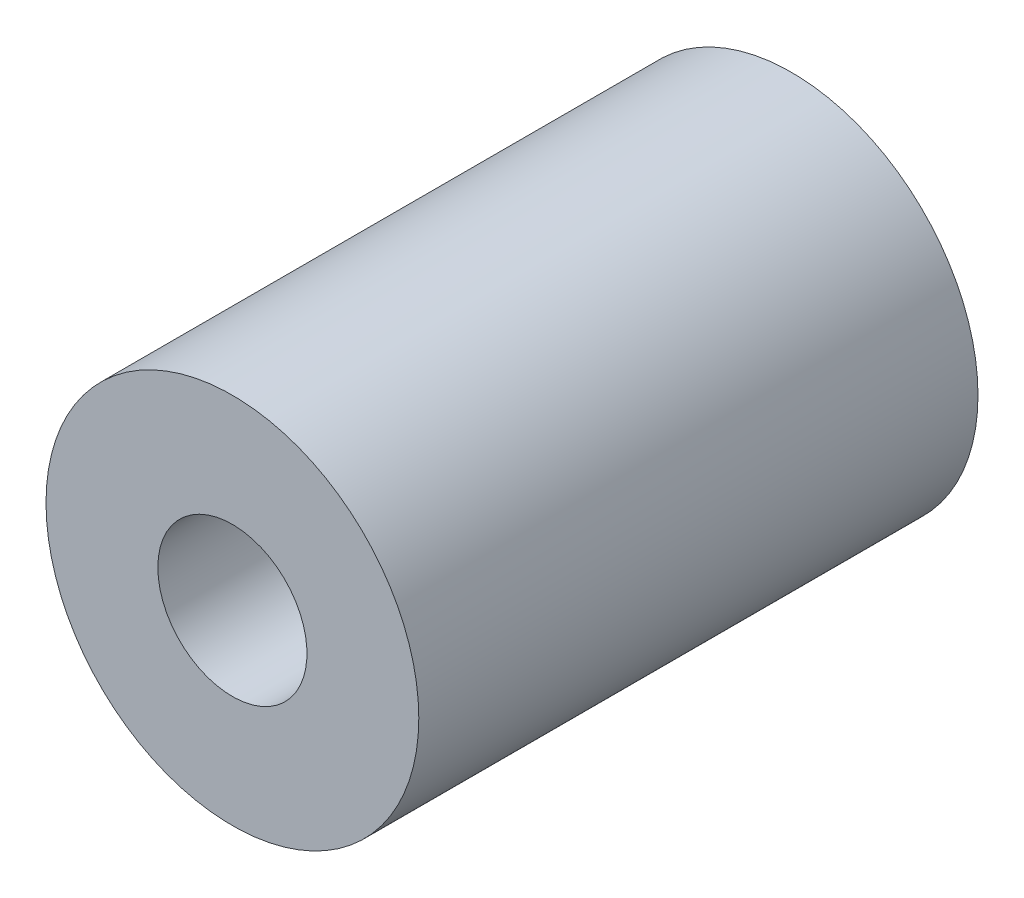
ISO-10303-21;
HEADER;
FILE_DESCRIPTION(('STEP AP214'),'2;1');
FILE_NAME('part.step','',(''),(''),'','','');
FILE_SCHEMA(('AUTOMOTIVE_DESIGN { 1 0 10303 214 1 1 1 1 }'));
ENDSEC;
DATA;
#1=APPLICATION_CONTEXT('core data for automotive mechanical design processes');
#2=APPLICATION_PROTOCOL_DEFINITION('international standard','automotive_design',2000,#1);
#3=PRODUCT_CONTEXT('',#1,'mechanical');
#4=PRODUCT('Part','Part','',(#3));
#5=PRODUCT_RELATED_PRODUCT_CATEGORY('part','',(#4));
#6=PRODUCT_DEFINITION_FORMATION('','',#4);
#7=PRODUCT_DEFINITION_CONTEXT('part definition',#1,'design');
#8=PRODUCT_DEFINITION('design','',#6,#7);
#9=PRODUCT_DEFINITION_SHAPE('','',#8);
#10=(LENGTH_UNIT() NAMED_UNIT(*) SI_UNIT(.MILLI.,.METRE.));
#11=(NAMED_UNIT(*) PLANE_ANGLE_UNIT() SI_UNIT($,.RADIAN.));
#12=(NAMED_UNIT(*) SI_UNIT($,.STERADIAN.) SOLID_ANGLE_UNIT());
#13=UNCERTAINTY_MEASURE_WITH_UNIT(LENGTH_MEASURE(1.E-05),#10,'distance_accuracy_value','');
#14=(GEOMETRIC_REPRESENTATION_CONTEXT(3) GLOBAL_UNCERTAINTY_ASSIGNED_CONTEXT((#13)) GLOBAL_UNIT_ASSIGNED_CONTEXT((#10,
#11,#12)) REPRESENTATION_CONTEXT('',''));
#15=CARTESIAN_POINT('',(0.,0.,0.));
#16=DIRECTION('',(0.,0.,1.));
#17=DIRECTION('',(1.,0.,0.));
#18=AXIS2_PLACEMENT_3D('',#15,#16,#17);
#19=CARTESIAN_POINT('',(0.,0.,29.9999999999998));
#20=DIRECTION('',(0.,0.,0.999999999999997));
#21=DIRECTION('',(1.,0.,0.));
#22=AXIS2_PLACEMENT_3D('',#19,#20,#21);
#23=PLANE('',#22);
#24=CARTESIAN_POINT('',(0.,0.,29.9999999999998));
#25=DIRECTION('',(0.,0.,0.999999999999997));
#26=DIRECTION('',(1.,0.,0.));
#27=AXIS2_PLACEMENT_3D('',#24,#25,#26);
#28=CIRCLE('',#27,10.);
#29=CARTESIAN_POINT('',(-10.,0.,29.9999999999998));
#30=VERTEX_POINT('',#29);
#31=EDGE_CURVE('E12',#30,#30,#28,.T.);
#32=ORIENTED_EDGE('',*,*,#31,.T.);
#33=EDGE_LOOP('',(#32));
#34=FACE_BOUND('',#33,.T.);
#35=CARTESIAN_POINT('',(0.,0.,29.9999999999998));
#36=DIRECTION('',(0.,0.,0.999999999999997));
#37=DIRECTION('',(1.,0.,0.));
#38=AXIS2_PLACEMENT_3D('',#35,#36,#37);
#39=CIRCLE('',#38,4.);
#40=CARTESIAN_POINT('',(-4.00000000000001,0.,29.9999999999998));
#41=VERTEX_POINT('',#40);
#42=EDGE_CURVE('E62',#41,#41,#39,.T.);
#43=ORIENTED_EDGE('',*,*,#42,.F.);
#44=EDGE_LOOP('',(#43));
#45=FACE_BOUND('',#44,.T.);
#46=ADVANCED_FACE('F48',(#34,#45),#23,.T.);
#47=CARTESIAN_POINT('',(0.,0.,0.));
#48=DIRECTION('',(0.,0.,0.999999999999997));
#49=DIRECTION('',(1.,0.,0.));
#50=AXIS2_PLACEMENT_3D('',#47,#48,#49);
#51=PLANE('',#50);
#52=CARTESIAN_POINT('',(0.,0.,0.));
#53=DIRECTION('',(0.,0.,0.999999999999997));
#54=DIRECTION('',(1.,0.,0.));
#55=AXIS2_PLACEMENT_3D('',#52,#53,#54);
#56=CIRCLE('',#55,10.);
#57=CARTESIAN_POINT('',(-10.,0.,0.));
#58=VERTEX_POINT('',#57);
#59=EDGE_CURVE('E52',#58,#58,#56,.T.);
#60=ORIENTED_EDGE('',*,*,#59,.F.);
#61=EDGE_LOOP('',(#60));
#62=FACE_BOUND('',#61,.T.);
#63=CARTESIAN_POINT('',(0.,0.,0.));
#64=DIRECTION('',(0.,0.,0.999999999999997));
#65=DIRECTION('',(1.,0.,0.));
#66=AXIS2_PLACEMENT_3D('',#63,#64,#65);
#67=CIRCLE('',#66,4.);
#68=CARTESIAN_POINT('',(-4.00000000000001,0.,0.));
#69=VERTEX_POINT('',#68);
#70=EDGE_CURVE('E64',#69,#69,#67,.T.);
#71=ORIENTED_EDGE('',*,*,#70,.T.);
#72=EDGE_LOOP('',(#71));
#73=FACE_BOUND('',#72,.T.);
#74=ADVANCED_FACE('F77',(#62,#73),#51,.F.);
#75=CARTESIAN_POINT('',(0.,0.,29.9999999999998));
#76=DIRECTION('',(0.,0.,-0.999999999999997));
#77=DIRECTION('',(-1.,0.,0.));
#78=AXIS2_PLACEMENT_3D('',#75,#76,#77);
#79=CYLINDRICAL_SURFACE('',#78,10.);
#80=CARTESIAN_POINT('',(-10.,0.,29.9999999999998));
#81=CARTESIAN_POINT('',(-10.,0.,29.6874999999998));
#82=CARTESIAN_POINT('',(-10.,0.,29.3749999999998));
#83=CARTESIAN_POINT('',(-10.,0.,28.7499999999998));
#84=CARTESIAN_POINT('',(-10.,0.,28.4374999999998));
#85=CARTESIAN_POINT('',(-10.,0.,27.8124999999998));
#86=CARTESIAN_POINT('',(-10.,0.,27.4999999999999));
#87=CARTESIAN_POINT('',(-10.,0.,26.8749999999999));
#88=CARTESIAN_POINT('',(-10.,0.,26.5624999999999));
#89=CARTESIAN_POINT('',(-10.,0.,25.9374999999999));
#90=CARTESIAN_POINT('',(-10.,0.,25.6249999999999));
#91=CARTESIAN_POINT('',(-10.,0.,24.9999999999999));
#92=CARTESIAN_POINT('',(-10.,0.,24.6874999999999));
#93=CARTESIAN_POINT('',(-10.,0.,24.0624999999999));
#94=CARTESIAN_POINT('',(-10.,0.,23.7499999999999));
#95=CARTESIAN_POINT('',(-10.,0.,23.1249999999999));
#96=CARTESIAN_POINT('',(-10.,0.,22.8124999999999));
#97=CARTESIAN_POINT('',(-10.,0.,22.1874999999999));
#98=CARTESIAN_POINT('',(-10.,0.,21.8749999999999));
#99=CARTESIAN_POINT('',(-10.,0.,21.2499999999999));
#100=CARTESIAN_POINT('',(-10.,0.,20.9374999999999));
#101=CARTESIAN_POINT('',(-10.,0.,20.3124999999999));
#102=CARTESIAN_POINT('',(-10.,0.,19.9999999999999));
#103=CARTESIAN_POINT('',(-10.,0.,19.3749999999999));
#104=CARTESIAN_POINT('',(-10.,0.,19.0624999999999));
#105=CARTESIAN_POINT('',(-10.,0.,18.4374999999999));
#106=CARTESIAN_POINT('',(-10.,0.,18.1249999999999));
#107=CARTESIAN_POINT('',(-10.,0.,17.4999999999999));
#108=CARTESIAN_POINT('',(-10.,0.,17.1874999999999));
#109=CARTESIAN_POINT('',(-10.,0.,16.5624999999999));
#110=CARTESIAN_POINT('',(-10.,0.,16.2499999999999));
#111=CARTESIAN_POINT('',(-10.,0.,15.6249999999999));
#112=CARTESIAN_POINT('',(-10.,0.,15.3124999999999));
#113=CARTESIAN_POINT('',(-10.,0.,14.6874999999999));
#114=CARTESIAN_POINT('',(-10.,0.,14.3749999999999));
#115=CARTESIAN_POINT('',(-10.,0.,13.7499999999999));
#116=CARTESIAN_POINT('',(-10.,0.,13.4374999999999));
#117=CARTESIAN_POINT('',(-10.,0.,12.8124999999999));
#118=CARTESIAN_POINT('',(-10.,0.,12.4999999999999));
#119=CARTESIAN_POINT('',(-10.,0.,11.8749999999999));
#120=CARTESIAN_POINT('',(-10.,0.,11.5624999999999));
#121=CARTESIAN_POINT('',(-10.,0.,10.9374999999999));
#122=CARTESIAN_POINT('',(-10.,0.,10.6249999999999));
#123=CARTESIAN_POINT('',(-10.,0.,9.99999999999994));
#124=CARTESIAN_POINT('',(-10.,0.,9.68749999999995));
#125=CARTESIAN_POINT('',(-10.,0.,9.06249999999995));
#126=CARTESIAN_POINT('',(-10.,0.,8.74999999999995));
#127=CARTESIAN_POINT('',(-10.,0.,8.12499999999996));
#128=CARTESIAN_POINT('',(-10.,0.,7.81249999999995));
#129=CARTESIAN_POINT('',(-10.,0.,7.18749999999996));
#130=CARTESIAN_POINT('',(-10.,0.,6.87499999999996));
#131=CARTESIAN_POINT('',(-10.,0.,6.24999999999996));
#132=CARTESIAN_POINT('',(-10.,0.,5.93749999999996));
#133=CARTESIAN_POINT('',(-10.,0.,5.31249999999997));
#134=CARTESIAN_POINT('',(-10.,0.,4.99999999999997));
#135=CARTESIAN_POINT('',(-10.,0.,4.37499999999997));
#136=CARTESIAN_POINT('',(-10.,0.,4.06249999999997));
#137=CARTESIAN_POINT('',(-10.,0.,3.43749999999998));
#138=CARTESIAN_POINT('',(-10.,0.,3.12499999999998));
#139=CARTESIAN_POINT('',(-10.,0.,2.49999999999998));
#140=CARTESIAN_POINT('',(-10.,0.,2.18749999999999));
#141=CARTESIAN_POINT('',(-10.,0.,1.56249999999999));
#142=CARTESIAN_POINT('',(-10.,0.,1.24999999999999));
#143=CARTESIAN_POINT('',(-10.,0.,0.624999999999993));
#144=CARTESIAN_POINT('',(-10.,0.,0.312499999999995));
#145=CARTESIAN_POINT('',(-10.,0.,0.));
#146=B_SPLINE_CURVE_WITH_KNOTS('',3,(#80,#81,#82,#83,#84,#85,#86,#87,#88,#89,#90,#91,#92,#93,
#94,#95,#96,#97,#98,#99,#100,#101,#102,#103,#104,#105,#106,#107,#108,#109,#110,#111,#112,#113,
#114,#115,#116,#117,#118,#119,#120,#121,#122,#123,#124,#125,#126,#127,#128,#129,#130,#131,#132,
#133,#134,#135,#136,#137,#138,#139,#140,#141,#142,#143,#144,#145),.UNSPECIFIED.,.F.,.F.,(4,2,2,
2,2,2,2,2,2,2,2,2,2,2,2,2,2,2,2,2,2,2,2,2,2,2,2,2,2,2,2,2,4),(0.,0.937499999999997,
1.87499999999999,2.81249999999999,3.74999999999998,4.68749999999998,5.62499999999997,
6.56249999999997,7.49999999999996,8.43749999999996,9.37499999999995,10.3124999999999,
11.2499999999999,12.1874999999999,13.1249999999999,14.0624999999999,14.9999999999999,
15.9374999999999,16.8749999999999,17.8124999999999,18.7499999999999,19.6874999999999,
20.6249999999999,21.5624999999999,22.4999999999999,23.4374999999999,24.3749999999999,
25.3124999999999,26.2499999999999,27.1874999999999,28.1249999999999,29.0624999999998,
29.9999999999998),.UNSPECIFIED.);
#147=EDGE_CURVE('BSEAM50',#30,#58,#146,.T.);
#148=ORIENTED_EDGE('',*,*,#31,.F.);
#149=ORIENTED_EDGE('',*,*,#59,.T.);
#150=ORIENTED_EDGE('',*,*,#147,.T.);
#151=ORIENTED_EDGE('',*,*,#147,.F.);
#152=EDGE_LOOP('',(#148,#150,#149,#151));
#153=FACE_BOUND('',#152,.T.);
#154=ADVANCED_FACE('F50',(#153),#79,.T.);
#155=CARTESIAN_POINT('',(0.,0.,29.9999999999998));
#156=DIRECTION('',(0.,0.,-0.999999999999997));
#157=DIRECTION('',(-1.,0.,0.));
#158=AXIS2_PLACEMENT_3D('',#155,#156,#157);
#159=CYLINDRICAL_SURFACE('',#158,4.);
#160=CARTESIAN_POINT('',(-4.00000000000001,0.,29.9999999999998));
#161=CARTESIAN_POINT('',(-4.00000000000001,0.,29.6874999999998));
#162=CARTESIAN_POINT('',(-4.00000000000001,0.,29.3749999999998));
#163=CARTESIAN_POINT('',(-4.00000000000001,0.,28.7499999999998));
#164=CARTESIAN_POINT('',(-4.00000000000001,0.,28.4374999999998));
#165=CARTESIAN_POINT('',(-4.00000000000001,0.,27.8124999999998));
#166=CARTESIAN_POINT('',(-4.00000000000001,0.,27.4999999999999));
#167=CARTESIAN_POINT('',(-4.00000000000001,0.,26.8749999999999));
#168=CARTESIAN_POINT('',(-4.00000000000001,0.,26.5624999999999));
#169=CARTESIAN_POINT('',(-4.00000000000001,0.,25.9374999999999));
#170=CARTESIAN_POINT('',(-4.00000000000001,0.,25.6249999999999));
#171=CARTESIAN_POINT('',(-4.00000000000001,0.,24.9999999999999));
#172=CARTESIAN_POINT('',(-4.00000000000001,0.,24.6874999999999));
#173=CARTESIAN_POINT('',(-4.00000000000001,0.,24.0624999999999));
#174=CARTESIAN_POINT('',(-4.00000000000001,0.,23.7499999999999));
#175=CARTESIAN_POINT('',(-4.00000000000001,0.,23.1249999999999));
#176=CARTESIAN_POINT('',(-4.00000000000001,0.,22.8124999999999));
#177=CARTESIAN_POINT('',(-4.00000000000001,0.,22.1874999999999));
#178=CARTESIAN_POINT('',(-4.00000000000001,0.,21.8749999999999));
#179=CARTESIAN_POINT('',(-4.00000000000001,0.,21.2499999999999));
#180=CARTESIAN_POINT('',(-4.00000000000001,0.,20.9374999999999));
#181=CARTESIAN_POINT('',(-4.00000000000001,0.,20.3124999999999));
#182=CARTESIAN_POINT('',(-4.00000000000001,0.,19.9999999999999));
#183=CARTESIAN_POINT('',(-4.00000000000001,0.,19.3749999999999));
#184=CARTESIAN_POINT('',(-4.00000000000001,0.,19.0624999999999));
#185=CARTESIAN_POINT('',(-4.00000000000001,0.,18.4374999999999));
#186=CARTESIAN_POINT('',(-4.00000000000001,0.,18.1249999999999));
#187=CARTESIAN_POINT('',(-4.00000000000001,0.,17.4999999999999));
#188=CARTESIAN_POINT('',(-4.00000000000001,0.,17.1874999999999));
#189=CARTESIAN_POINT('',(-4.00000000000001,0.,16.5624999999999));
#190=CARTESIAN_POINT('',(-4.00000000000001,0.,16.2499999999999));
#191=CARTESIAN_POINT('',(-4.00000000000001,0.,15.6249999999999));
#192=CARTESIAN_POINT('',(-4.00000000000001,0.,15.3124999999999));
#193=CARTESIAN_POINT('',(-4.00000000000001,0.,14.6874999999999));
#194=CARTESIAN_POINT('',(-4.00000000000001,0.,14.3749999999999));
#195=CARTESIAN_POINT('',(-4.00000000000001,0.,13.7499999999999));
#196=CARTESIAN_POINT('',(-4.00000000000001,0.,13.4374999999999));
#197=CARTESIAN_POINT('',(-4.00000000000001,0.,12.8124999999999));
#198=CARTESIAN_POINT('',(-4.00000000000001,0.,12.4999999999999));
#199=CARTESIAN_POINT('',(-4.00000000000001,0.,11.8749999999999));
#200=CARTESIAN_POINT('',(-4.00000000000001,0.,11.5624999999999));
#201=CARTESIAN_POINT('',(-4.00000000000001,0.,10.9374999999999));
#202=CARTESIAN_POINT('',(-4.00000000000001,0.,10.6249999999999));
#203=CARTESIAN_POINT('',(-4.00000000000001,0.,9.99999999999994));
#204=CARTESIAN_POINT('',(-4.00000000000001,0.,9.68749999999994));
#205=CARTESIAN_POINT('',(-4.00000000000001,0.,9.06249999999995));
#206=CARTESIAN_POINT('',(-4.00000000000001,0.,8.74999999999995));
#207=CARTESIAN_POINT('',(-4.00000000000001,0.,8.12499999999995));
#208=CARTESIAN_POINT('',(-4.00000000000001,0.,7.81249999999995));
#209=CARTESIAN_POINT('',(-4.00000000000001,0.,7.18749999999996));
#210=CARTESIAN_POINT('',(-4.00000000000001,0.,6.87499999999996));
#211=CARTESIAN_POINT('',(-4.00000000000001,0.,6.24999999999996));
#212=CARTESIAN_POINT('',(-4.00000000000001,0.,5.93749999999996));
#213=CARTESIAN_POINT('',(-4.00000000000001,0.,5.31249999999997));
#214=CARTESIAN_POINT('',(-4.00000000000001,0.,4.99999999999997));
#215=CARTESIAN_POINT('',(-4.00000000000001,0.,4.37499999999997));
#216=CARTESIAN_POINT('',(-4.00000000000001,0.,4.06249999999997));
#217=CARTESIAN_POINT('',(-4.00000000000001,0.,3.43749999999998));
#218=CARTESIAN_POINT('',(-4.00000000000001,0.,3.12499999999998));
#219=CARTESIAN_POINT('',(-4.00000000000001,0.,2.49999999999998));
#220=CARTESIAN_POINT('',(-4.00000000000001,0.,2.18749999999999));
#221=CARTESIAN_POINT('',(-4.00000000000001,0.,1.56249999999999));
#222=CARTESIAN_POINT('',(-4.00000000000001,0.,1.24999999999999));
#223=CARTESIAN_POINT('',(-4.00000000000001,0.,0.624999999999993));
#224=CARTESIAN_POINT('',(-4.00000000000001,0.,0.312499999999995));
#225=CARTESIAN_POINT('',(-4.00000000000001,0.,0.));
#226=B_SPLINE_CURVE_WITH_KNOTS('',3,(#160,#161,#162,#163,#164,#165,#166,#167,#168,#169,#170,
#171,#172,#173,#174,#175,#176,#177,#178,#179,#180,#181,#182,#183,#184,#185,#186,#187,#188,#189,
#190,#191,#192,#193,#194,#195,#196,#197,#198,#199,#200,#201,#202,#203,#204,#205,#206,#207,#208,
#209,#210,#211,#212,#213,#214,#215,#216,#217,#218,#219,#220,#221,#222,#223,#224,#225),
.UNSPECIFIED.,.F.,.F.,(4,2,2,2,2,2,2,2,2,2,2,2,2,2,2,2,2,2,2,2,2,2,2,2,2,2,2,2,2,2,2,2,4),(0.,
0.937499999999994,1.87499999999999,2.81249999999999,3.74999999999998,4.68749999999997,
5.62499999999997,6.56249999999996,7.49999999999996,8.43749999999996,9.37499999999995,
10.3124999999999,11.2499999999999,12.1874999999999,13.1249999999999,14.0624999999999,
14.9999999999999,15.9374999999999,16.8749999999999,17.8124999999999,18.7499999999999,
19.6874999999999,20.6249999999999,21.5624999999999,22.4999999999999,23.4374999999999,
24.3749999999999,25.3124999999999,26.2499999999999,27.1874999999999,28.1249999999998,
29.0624999999998,29.9999999999998),.UNSPECIFIED.);
#227=EDGE_CURVE('BSEAM73',#41,#69,#226,.T.);
#228=ORIENTED_EDGE('',*,*,#42,.T.);
#229=ORIENTED_EDGE('',*,*,#70,.F.);
#230=ORIENTED_EDGE('',*,*,#227,.T.);
#231=ORIENTED_EDGE('',*,*,#227,.F.);
#232=EDGE_LOOP('',(#228,#230,#229,#231));
#233=FACE_BOUND('',#232,.T.);
#234=ADVANCED_FACE('F73',(#233),#159,.F.);
#235=CLOSED_SHELL('',(#46,#74,#154,#234));
#236=MANIFOLD_SOLID_BREP('B2',#235);
#237=ADVANCED_BREP_SHAPE_REPRESENTATION('',(#18,#236),#14);
#238=SHAPE_DEFINITION_REPRESENTATION(#9,#237);
ENDSEC;
END-ISO-10303-21;
